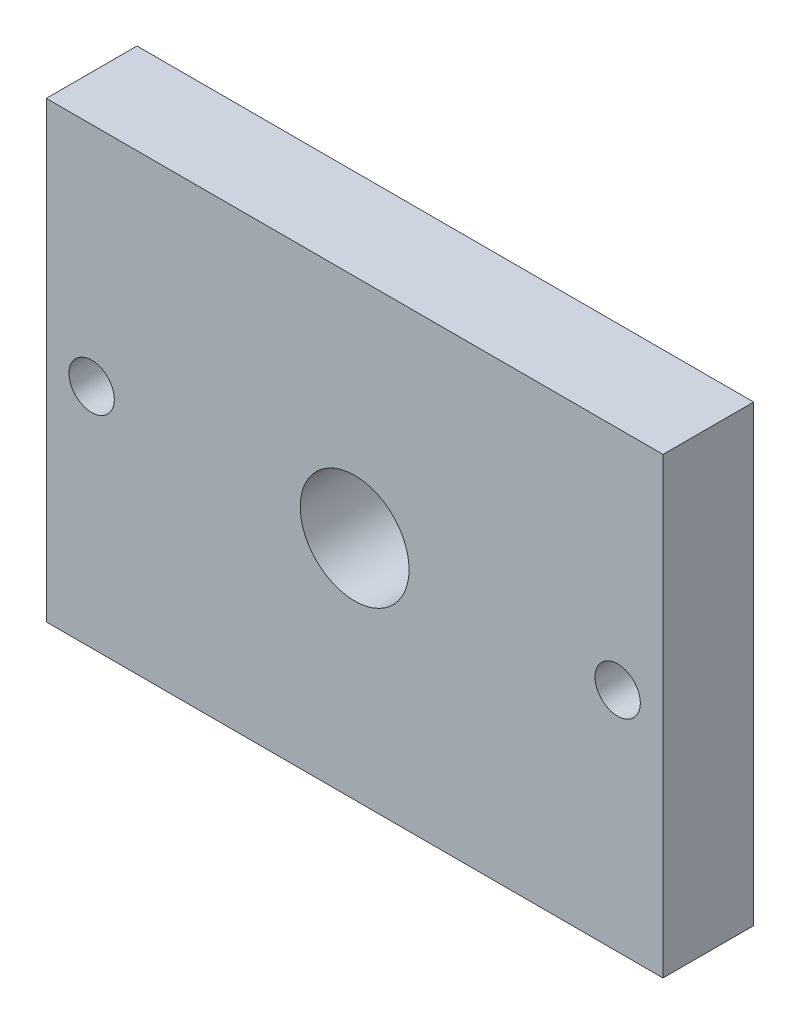
ISO-10303-21;
HEADER;
FILE_DESCRIPTION(('STEP AP214'),'2;1');
FILE_NAME('part.step','',(''),(''),'','','');
FILE_SCHEMA(('AUTOMOTIVE_DESIGN { 1 0 10303 214 1 1 1 1 }'));
ENDSEC;
DATA;
#1=APPLICATION_CONTEXT('core data for automotive mechanical design processes');
#2=APPLICATION_PROTOCOL_DEFINITION('international standard','automotive_design',2000,#1);
#3=PRODUCT_CONTEXT('',#1,'mechanical');
#4=PRODUCT('Part','Part','',(#3));
#5=PRODUCT_RELATED_PRODUCT_CATEGORY('part','',(#4));
#6=PRODUCT_DEFINITION_FORMATION('','',#4);
#7=PRODUCT_DEFINITION_CONTEXT('part definition',#1,'design');
#8=PRODUCT_DEFINITION('design','',#6,#7);
#9=PRODUCT_DEFINITION_SHAPE('','',#8);
#10=(LENGTH_UNIT() NAMED_UNIT(*) SI_UNIT(.MILLI.,.METRE.));
#11=(NAMED_UNIT(*) PLANE_ANGLE_UNIT() SI_UNIT($,.RADIAN.));
#12=(NAMED_UNIT(*) SI_UNIT($,.STERADIAN.) SOLID_ANGLE_UNIT());
#13=UNCERTAINTY_MEASURE_WITH_UNIT(LENGTH_MEASURE(1.E-05),#10,'distance_accuracy_value','');
#14=(GEOMETRIC_REPRESENTATION_CONTEXT(3) GLOBAL_UNCERTAINTY_ASSIGNED_CONTEXT((#13)) GLOBAL_UNIT_ASSIGNED_CONTEXT((#10,
#11,#12)) REPRESENTATION_CONTEXT('',''));
#15=CARTESIAN_POINT('',(0.,0.,0.));
#16=DIRECTION('',(0.,0.,1.));
#17=DIRECTION('',(1.,0.,0.));
#18=AXIS2_PLACEMENT_3D('',#15,#16,#17);
#19=CARTESIAN_POINT('',(0.,0.,10.));
#20=DIRECTION('',(0.,0.,1.));
#21=DIRECTION('',(1.,0.,0.));
#22=AXIS2_PLACEMENT_3D('',#19,#20,#21);
#23=PLANE('',#22);
#24=CARTESIAN_POINT('',(29.,0.,10.));
#25=DIRECTION('',(0.,0.,1.));
#26=DIRECTION('',(1.,0.,0.));
#27=AXIS2_PLACEMENT_3D('',#24,#25,#26);
#28=CIRCLE('',#27,2.49999999999999);
#29=CARTESIAN_POINT('',(31.5,0.,10.));
#30=VERTEX_POINT('',#29);
#31=EDGE_CURVE('E134',#30,#30,#28,.T.);
#32=ORIENTED_EDGE('',*,*,#31,.F.);
#33=EDGE_LOOP('',(#32));
#34=FACE_BOUND('',#33,.T.);
#35=DIRECTION('',(0.,1.,0.));
#36=VECTOR('',#35,1.);
#37=CARTESIAN_POINT('',(34.,25.,10.));
#38=LINE('',#37,#36);
#39=CARTESIAN_POINT('',(34.,-25.,10.));
#40=VERTEX_POINT('',#39);
#41=CARTESIAN_POINT('',(34.,25.,10.));
#42=VERTEX_POINT('',#41);
#43=EDGE_CURVE('E92',#40,#42,#38,.T.);
#44=ORIENTED_EDGE('',*,*,#43,.T.);
#45=DIRECTION('',(-1.,0.,0.));
#46=VECTOR('',#45,1.);
#47=CARTESIAN_POINT('',(-34.,25.,10.));
#48=LINE('',#47,#46);
#49=CARTESIAN_POINT('',(-34.,25.,10.));
#50=VERTEX_POINT('',#49);
#51=EDGE_CURVE('E87',#42,#50,#48,.T.);
#52=ORIENTED_EDGE('',*,*,#51,.T.);
#53=DIRECTION('',(0.,-1.,0.));
#54=VECTOR('',#53,1.);
#55=CARTESIAN_POINT('',(-34.,25.,10.));
#56=LINE('',#55,#54);
#57=CARTESIAN_POINT('',(-34.,-25.,10.));
#58=VERTEX_POINT('',#57);
#59=EDGE_CURVE('E90',#50,#58,#56,.T.);
#60=ORIENTED_EDGE('',*,*,#59,.T.);
#61=DIRECTION('',(1.,0.,0.));
#62=VECTOR('',#61,1.);
#63=CARTESIAN_POINT('',(-34.,-25.,10.));
#64=LINE('',#63,#62);
#65=EDGE_CURVE('E57',#58,#40,#64,.T.);
#66=ORIENTED_EDGE('',*,*,#65,.T.);
#67=EDGE_LOOP('',(#44,#52,#60,#66));
#68=FACE_BOUND('',#67,.T.);
#69=CARTESIAN_POINT('',(0.,0.,10.));
#70=DIRECTION('',(0.,0.,1.));
#71=DIRECTION('',(1.,0.,0.));
#72=AXIS2_PLACEMENT_3D('',#69,#70,#71);
#73=CIRCLE('',#72,6.);
#74=CARTESIAN_POINT('',(6.,0.,10.));
#75=VERTEX_POINT('',#74);
#76=EDGE_CURVE('E112',#75,#75,#73,.T.);
#77=ORIENTED_EDGE('',*,*,#76,.F.);
#78=EDGE_LOOP('',(#77));
#79=FACE_BOUND('',#78,.T.);
#80=CARTESIAN_POINT('',(-29.,0.,10.));
#81=DIRECTION('',(0.,0.,1.));
#82=DIRECTION('',(1.,0.,0.));
#83=AXIS2_PLACEMENT_3D('',#80,#81,#82);
#84=CIRCLE('',#83,2.5);
#85=CARTESIAN_POINT('',(-26.5,0.,10.));
#86=VERTEX_POINT('',#85);
#87=EDGE_CURVE('E142',#86,#86,#84,.T.);
#88=ORIENTED_EDGE('',*,*,#87,.F.);
#89=EDGE_LOOP('',(#88));
#90=FACE_BOUND('',#89,.T.);
#91=ADVANCED_FACE('F39',(#34,#68,#79,#90),#23,.T.);
#92=CARTESIAN_POINT('',(0.,0.,0.));
#93=DIRECTION('',(0.,0.,1.));
#94=DIRECTION('',(1.,0.,0.));
#95=AXIS2_PLACEMENT_3D('',#92,#93,#94);
#96=PLANE('',#95);
#97=DIRECTION('',(0.,1.,0.));
#98=VECTOR('',#97,1.);
#99=CARTESIAN_POINT('',(34.,25.,0.));
#100=LINE('',#99,#98);
#101=CARTESIAN_POINT('',(34.,-25.,0.));
#102=VERTEX_POINT('',#101);
#103=CARTESIAN_POINT('',(34.,25.,0.));
#104=VERTEX_POINT('',#103);
#105=EDGE_CURVE('E108',#102,#104,#100,.T.);
#106=ORIENTED_EDGE('',*,*,#105,.F.);
#107=DIRECTION('',(1.,0.,0.));
#108=VECTOR('',#107,1.);
#109=CARTESIAN_POINT('',(-34.,-25.,0.));
#110=LINE('',#109,#108);
#111=CARTESIAN_POINT('',(-34.,-25.,0.));
#112=VERTEX_POINT('',#111);
#113=EDGE_CURVE('E80',#112,#102,#110,.T.);
#114=ORIENTED_EDGE('',*,*,#113,.F.);
#115=DIRECTION('',(0.,-1.,0.));
#116=VECTOR('',#115,1.);
#117=CARTESIAN_POINT('',(-34.,25.,0.));
#118=LINE('',#117,#116);
#119=CARTESIAN_POINT('',(-34.,25.,0.));
#120=VERTEX_POINT('',#119);
#121=EDGE_CURVE('E74',#120,#112,#118,.T.);
#122=ORIENTED_EDGE('',*,*,#121,.F.);
#123=DIRECTION('',(-1.,0.,0.));
#124=VECTOR('',#123,1.);
#125=CARTESIAN_POINT('',(-34.,25.,0.));
#126=LINE('',#125,#124);
#127=EDGE_CURVE('E97',#104,#120,#126,.T.);
#128=ORIENTED_EDGE('',*,*,#127,.F.);
#129=EDGE_LOOP('',(#106,#114,#122,#128));
#130=FACE_BOUND('',#129,.T.);
#131=CARTESIAN_POINT('',(0.,0.,0.));
#132=DIRECTION('',(0.,0.,1.));
#133=DIRECTION('',(1.,0.,0.));
#134=AXIS2_PLACEMENT_3D('',#131,#132,#133);
#135=CIRCLE('',#134,6.);
#136=CARTESIAN_POINT('',(6.,0.,0.));
#137=VERTEX_POINT('',#136);
#138=EDGE_CURVE('E130',#137,#137,#135,.T.);
#139=ORIENTED_EDGE('',*,*,#138,.T.);
#140=EDGE_LOOP('',(#139));
#141=FACE_BOUND('',#140,.T.);
#142=CARTESIAN_POINT('',(29.,0.,0.));
#143=DIRECTION('',(0.,0.,1.));
#144=DIRECTION('',(1.,0.,0.));
#145=AXIS2_PLACEMENT_3D('',#142,#143,#144);
#146=CIRCLE('',#145,2.49999999999999);
#147=CARTESIAN_POINT('',(31.5,0.,0.));
#148=VERTEX_POINT('',#147);
#149=EDGE_CURVE('E138',#148,#148,#146,.T.);
#150=ORIENTED_EDGE('',*,*,#149,.T.);
#151=EDGE_LOOP('',(#150));
#152=FACE_BOUND('',#151,.T.);
#153=CARTESIAN_POINT('',(-29.,0.,0.));
#154=DIRECTION('',(0.,0.,1.));
#155=DIRECTION('',(1.,0.,0.));
#156=AXIS2_PLACEMENT_3D('',#153,#154,#155);
#157=CIRCLE('',#156,2.5);
#158=CARTESIAN_POINT('',(-26.5,0.,0.));
#159=VERTEX_POINT('',#158);
#160=EDGE_CURVE('E146',#159,#159,#157,.T.);
#161=ORIENTED_EDGE('',*,*,#160,.T.);
#162=EDGE_LOOP('',(#161));
#163=FACE_BOUND('',#162,.T.);
#164=ADVANCED_FACE('F125',(#130,#141,#152,#163),#96,.F.);
#165=CARTESIAN_POINT('',(34.,25.,10.));
#166=DIRECTION('',(-1.,0.,0.));
#167=DIRECTION('',(0.,-1.,0.));
#168=AXIS2_PLACEMENT_3D('',#165,#166,#167);
#169=PLANE('',#168);
#170=ORIENTED_EDGE('',*,*,#105,.T.);
#171=DIRECTION('',(0.,0.,-1.));
#172=VECTOR('',#171,1.);
#173=CARTESIAN_POINT('',(34.,25.,10.));
#174=LINE('',#173,#172);
#175=EDGE_CURVE('E11',#42,#104,#174,.T.);
#176=ORIENTED_EDGE('',*,*,#175,.F.);
#177=ORIENTED_EDGE('',*,*,#43,.F.);
#178=DIRECTION('',(0.,0.,-1.));
#179=VECTOR('',#178,1.);
#180=CARTESIAN_POINT('',(34.,-25.,10.));
#181=LINE('',#180,#179);
#182=EDGE_CURVE('E104',#40,#102,#181,.T.);
#183=ORIENTED_EDGE('',*,*,#182,.T.);
#184=EDGE_LOOP('',(#170,#176,#177,#183));
#185=FACE_BOUND('',#184,.T.);
#186=ADVANCED_FACE('F41',(#185),#169,.F.);
#187=CARTESIAN_POINT('',(-34.,25.,10.));
#188=DIRECTION('',(0.,-1.,0.));
#189=DIRECTION('',(0.,0.,-1.));
#190=AXIS2_PLACEMENT_3D('',#187,#188,#189);
#191=PLANE('',#190);
#192=ORIENTED_EDGE('',*,*,#127,.T.);
#193=DIRECTION('',(0.,0.,-1.));
#194=VECTOR('',#193,1.);
#195=CARTESIAN_POINT('',(-34.,25.,10.));
#196=LINE('',#195,#194);
#197=EDGE_CURVE('E49',#50,#120,#196,.T.);
#198=ORIENTED_EDGE('',*,*,#197,.F.);
#199=ORIENTED_EDGE('',*,*,#51,.F.);
#200=ORIENTED_EDGE('',*,*,#175,.T.);
#201=EDGE_LOOP('',(#192,#198,#199,#200));
#202=FACE_BOUND('',#201,.T.);
#203=ADVANCED_FACE('F96',(#202),#191,.F.);
#204=CARTESIAN_POINT('',(-34.,25.,10.));
#205=DIRECTION('',(1.,0.,0.));
#206=DIRECTION('',(0.,1.,0.));
#207=AXIS2_PLACEMENT_3D('',#204,#205,#206);
#208=PLANE('',#207);
#209=ORIENTED_EDGE('',*,*,#121,.T.);
#210=DIRECTION('',(0.,0.,-1.));
#211=VECTOR('',#210,1.);
#212=CARTESIAN_POINT('',(-34.,-25.,10.));
#213=LINE('',#212,#211);
#214=EDGE_CURVE('E99',#58,#112,#213,.T.);
#215=ORIENTED_EDGE('',*,*,#214,.F.);
#216=ORIENTED_EDGE('',*,*,#59,.F.);
#217=ORIENTED_EDGE('',*,*,#197,.T.);
#218=EDGE_LOOP('',(#209,#215,#216,#217));
#219=FACE_BOUND('',#218,.T.);
#220=ADVANCED_FACE('F100',(#219),#208,.F.);
#221=CARTESIAN_POINT('',(-34.,-25.,10.));
#222=DIRECTION('',(0.,1.,0.));
#223=DIRECTION('',(0.,0.,1.));
#224=AXIS2_PLACEMENT_3D('',#221,#222,#223);
#225=PLANE('',#224);
#226=ORIENTED_EDGE('',*,*,#113,.T.);
#227=ORIENTED_EDGE('',*,*,#182,.F.);
#228=ORIENTED_EDGE('',*,*,#65,.F.);
#229=ORIENTED_EDGE('',*,*,#214,.T.);
#230=EDGE_LOOP('',(#226,#227,#228,#229));
#231=FACE_BOUND('',#230,.T.);
#232=ADVANCED_FACE('F122',(#231),#225,.F.);
#233=CARTESIAN_POINT('',(0.,0.,10.));
#234=DIRECTION('',(0.,0.,-1.));
#235=DIRECTION('',(-1.,0.,0.));
#236=AXIS2_PLACEMENT_3D('',#233,#234,#235);
#237=CYLINDRICAL_SURFACE('',#236,6.);
#238=ORIENTED_EDGE('',*,*,#76,.T.);
#239=EDGE_LOOP('',(#238));
#240=FACE_BOUND('',#239,.T.);
#241=ORIENTED_EDGE('',*,*,#138,.F.);
#242=EDGE_LOOP('',(#241));
#243=FACE_BOUND('',#242,.T.);
#244=ADVANCED_FACE('F166',(#240,#243),#237,.F.);
#245=CARTESIAN_POINT('',(29.,0.,10.));
#246=DIRECTION('',(0.,0.,-1.));
#247=DIRECTION('',(-1.,0.,0.));
#248=AXIS2_PLACEMENT_3D('',#245,#246,#247);
#249=CYLINDRICAL_SURFACE('',#248,2.49999999999999);
#250=ORIENTED_EDGE('',*,*,#31,.T.);
#251=EDGE_LOOP('',(#250));
#252=FACE_BOUND('',#251,.T.);
#253=ORIENTED_EDGE('',*,*,#149,.F.);
#254=EDGE_LOOP('',(#253));
#255=FACE_BOUND('',#254,.T.);
#256=ADVANCED_FACE('F212',(#252,#255),#249,.F.);
#257=CARTESIAN_POINT('',(-29.,0.,10.));
#258=DIRECTION('',(0.,0.,-1.));
#259=DIRECTION('',(-1.,0.,0.));
#260=AXIS2_PLACEMENT_3D('',#257,#258,#259);
#261=CYLINDRICAL_SURFACE('',#260,2.5);
#262=ORIENTED_EDGE('',*,*,#87,.T.);
#263=EDGE_LOOP('',(#262));
#264=FACE_BOUND('',#263,.T.);
#265=ORIENTED_EDGE('',*,*,#160,.F.);
#266=EDGE_LOOP('',(#265));
#267=FACE_BOUND('',#266,.T.);
#268=ADVANCED_FACE('F154',(#264,#267),#261,.F.);
#269=CLOSED_SHELL('',(#91,#164,#186,#203,#220,#232,#244,#256,#268));
#270=MANIFOLD_SOLID_BREP('B2',#269);
#271=ADVANCED_BREP_SHAPE_REPRESENTATION('',(#18,#270),#14);
#272=SHAPE_DEFINITION_REPRESENTATION(#9,#271);
ENDSEC;
END-ISO-10303-21;
